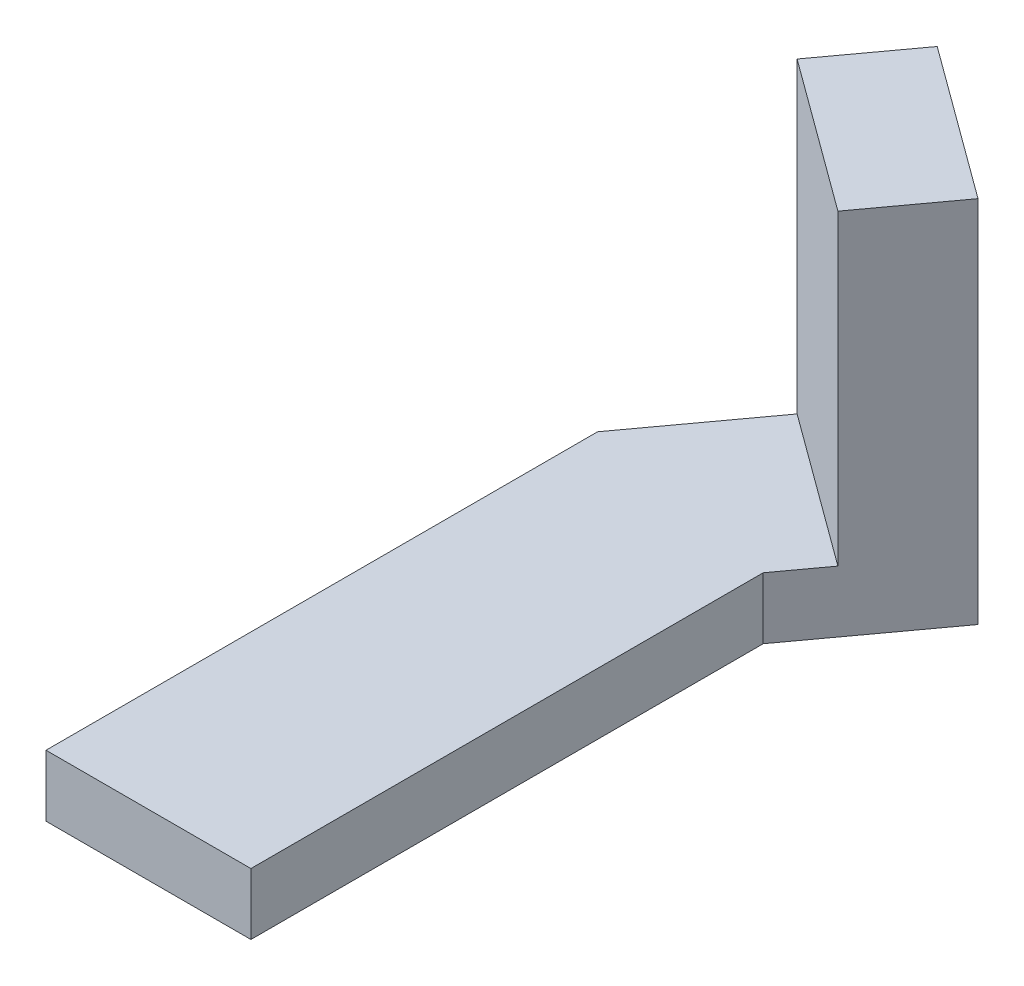
ISO-10303-21;
HEADER;
FILE_DESCRIPTION(('STEP AP214'),'2;1');
FILE_NAME('part.step','',(''),(''),'','','');
FILE_SCHEMA(('AUTOMOTIVE_DESIGN { 1 0 10303 214 1 1 1 1 }'));
ENDSEC;
DATA;
#1=APPLICATION_CONTEXT('core data for automotive mechanical design processes');
#2=APPLICATION_PROTOCOL_DEFINITION('international standard','automotive_design',2000,#1);
#3=PRODUCT_CONTEXT('',#1,'mechanical');
#4=PRODUCT('Part','Part','',(#3));
#5=PRODUCT_RELATED_PRODUCT_CATEGORY('part','',(#4));
#6=PRODUCT_DEFINITION_FORMATION('','',#4);
#7=PRODUCT_DEFINITION_CONTEXT('part definition',#1,'design');
#8=PRODUCT_DEFINITION('design','',#6,#7);
#9=PRODUCT_DEFINITION_SHAPE('','',#8);
#10=(LENGTH_UNIT() NAMED_UNIT(*) SI_UNIT(.MILLI.,.METRE.));
#11=(NAMED_UNIT(*) PLANE_ANGLE_UNIT() SI_UNIT($,.RADIAN.));
#12=(NAMED_UNIT(*) SI_UNIT($,.STERADIAN.) SOLID_ANGLE_UNIT());
#13=UNCERTAINTY_MEASURE_WITH_UNIT(LENGTH_MEASURE(1.E-05),#10,'distance_accuracy_value','');
#14=(GEOMETRIC_REPRESENTATION_CONTEXT(3) GLOBAL_UNCERTAINTY_ASSIGNED_CONTEXT((#13)) GLOBAL_UNIT_ASSIGNED_CONTEXT((#10,
#11,#12)) REPRESENTATION_CONTEXT('',''));
#15=CARTESIAN_POINT('',(0.,0.,0.));
#16=DIRECTION('',(0.,0.,1.));
#17=DIRECTION('',(1.,0.,0.));
#18=AXIS2_PLACEMENT_3D('',#15,#16,#17);
#19=CARTESIAN_POINT('',(0.,6.,-53.8333638680084));
#20=DIRECTION('',(1.,0.,0.));
#21=DIRECTION('',(0.,0.,-1.));
#22=AXIS2_PLACEMENT_3D('',#19,#20,#21);
#23=PLANE('',#22);
#24=DIRECTION('',(0.,0.,1.));
#25=VECTOR('',#24,1.);
#26=CARTESIAN_POINT('',(0.,0.,-53.8333638680084));
#27=LINE('',#26,#25);
#28=CARTESIAN_POINT('',(0.,0.,-53.8333638680084));
#29=VERTEX_POINT('',#28);
#30=CARTESIAN_POINT('',(0.,0.,0.));
#31=VERTEX_POINT('',#30);
#32=EDGE_CURVE('E157',#29,#31,#27,.T.);
#33=ORIENTED_EDGE('',*,*,#32,.T.);
#34=DIRECTION('',(0.,-1.,0.));
#35=VECTOR('',#34,1.);
#36=CARTESIAN_POINT('',(0.,6.,0.));
#37=LINE('',#36,#35);
#38=CARTESIAN_POINT('',(0.,6.,0.));
#39=VERTEX_POINT('',#38);
#40=EDGE_CURVE('E11',#39,#31,#37,.T.);
#41=ORIENTED_EDGE('',*,*,#40,.F.);
#42=DIRECTION('',(0.,0.,1.));
#43=VECTOR('',#42,1.);
#44=CARTESIAN_POINT('',(0.,6.,-53.8333638680084));
#45=LINE('',#44,#43);
#46=CARTESIAN_POINT('',(0.,6.,-53.8333638680084));
#47=VERTEX_POINT('',#46);
#48=EDGE_CURVE('E158',#47,#39,#45,.T.);
#49=ORIENTED_EDGE('',*,*,#48,.F.);
#50=DIRECTION('',(0.,-1.,0.));
#51=VECTOR('',#50,1.);
#52=CARTESIAN_POINT('',(0.,6.,-53.8333638680084));
#53=LINE('',#52,#51);
#54=EDGE_CURVE('E126',#47,#29,#53,.T.);
#55=ORIENTED_EDGE('',*,*,#54,.T.);
#56=EDGE_LOOP('',(#33,#41,#49,#55));
#57=FACE_BOUND('',#56,.T.);
#58=ADVANCED_FACE('F45',(#57),#23,.F.);
#59=CARTESIAN_POINT('',(0.,6.,0.));
#60=DIRECTION('',(0.,0.,-1.));
#61=DIRECTION('',(-1.,0.,0.));
#62=AXIS2_PLACEMENT_3D('',#59,#60,#61);
#63=PLANE('',#62);
#64=DIRECTION('',(1.,0.,0.));
#65=VECTOR('',#64,1.);
#66=CARTESIAN_POINT('',(0.,0.,0.));
#67=LINE('',#66,#65);
#68=CARTESIAN_POINT('',(20.,0.,0.));
#69=VERTEX_POINT('',#68);
#70=EDGE_CURVE('E174',#31,#69,#67,.T.);
#71=ORIENTED_EDGE('',*,*,#70,.T.);
#72=DIRECTION('',(0.,-1.,0.));
#73=VECTOR('',#72,1.);
#74=CARTESIAN_POINT('',(20.,6.,0.));
#75=LINE('',#74,#73);
#76=CARTESIAN_POINT('',(20.,6.,0.));
#77=VERTEX_POINT('',#76);
#78=EDGE_CURVE('E53',#77,#69,#75,.T.);
#79=ORIENTED_EDGE('',*,*,#78,.F.);
#80=DIRECTION('',(1.,0.,0.));
#81=VECTOR('',#80,1.);
#82=CARTESIAN_POINT('',(0.,6.,0.));
#83=LINE('',#82,#81);
#84=EDGE_CURVE('E100',#39,#77,#83,.T.);
#85=ORIENTED_EDGE('',*,*,#84,.F.);
#86=ORIENTED_EDGE('',*,*,#40,.T.);
#87=EDGE_LOOP('',(#71,#79,#85,#86));
#88=FACE_BOUND('',#87,.T.);
#89=ADVANCED_FACE('F223',(#88),#63,.F.);
#90=CARTESIAN_POINT('',(20.,6.,0.));
#91=DIRECTION('',(-1.,0.,0.));
#92=DIRECTION('',(0.,0.,1.));
#93=AXIS2_PLACEMENT_3D('',#90,#91,#92);
#94=PLANE('',#93);
#95=DIRECTION('',(0.,0.,-1.));
#96=VECTOR('',#95,1.);
#97=CARTESIAN_POINT('',(20.,0.,0.));
#98=LINE('',#97,#96);
#99=CARTESIAN_POINT('',(20.,0.,-50.));
#100=VERTEX_POINT('',#99);
#101=EDGE_CURVE('E177',#69,#100,#98,.T.);
#102=ORIENTED_EDGE('',*,*,#101,.T.);
#103=DIRECTION('',(0.,-1.,0.));
#104=VECTOR('',#103,1.);
#105=CARTESIAN_POINT('',(20.,6.,-50.));
#106=LINE('',#105,#104);
#107=CARTESIAN_POINT('',(20.,6.,-50.));
#108=VERTEX_POINT('',#107);
#109=EDGE_CURVE('E191',#108,#100,#106,.T.);
#110=ORIENTED_EDGE('',*,*,#109,.F.);
#111=DIRECTION('',(0.,0.,-1.));
#112=VECTOR('',#111,1.);
#113=CARTESIAN_POINT('',(20.,6.,0.));
#114=LINE('',#113,#112);
#115=EDGE_CURVE('E163',#77,#108,#114,.T.);
#116=ORIENTED_EDGE('',*,*,#115,.F.);
#117=ORIENTED_EDGE('',*,*,#78,.T.);
#118=EDGE_LOOP('',(#102,#110,#116,#117));
#119=FACE_BOUND('',#118,.T.);
#120=ADVANCED_FACE('F199',(#119),#94,.F.);
#121=CARTESIAN_POINT('',(20.,6.,-50.));
#122=DIRECTION('',(-0.806963294861052,0.,-0.590601592232018));
#123=DIRECTION('',(-0.590601592232018,0.,0.806963294861052));
#124=AXIS2_PLACEMENT_3D('',#121,#122,#123);
#125=PLANE('',#124);
#126=DIRECTION('',(0.590601592232018,0.,-0.806963294861052));
#127=VECTOR('',#126,1.);
#128=CARTESIAN_POINT('',(20.,0.,-50.));
#129=LINE('',#128,#127);
#130=CARTESIAN_POINT('',(28.8590238834803,0.,-62.1044494229158));
#131=VERTEX_POINT('',#130);
#132=EDGE_CURVE('E180',#100,#131,#129,.T.);
#133=ORIENTED_EDGE('',*,*,#132,.T.);
#134=DIRECTION('',(0.,-1.,0.));
#135=VECTOR('',#134,1.);
#136=CARTESIAN_POINT('',(28.8590238834803,6.,-62.1044494229158));
#137=LINE('',#136,#135);
#138=CARTESIAN_POINT('',(28.8590238834803,36.,-62.1044494229158));
#139=VERTEX_POINT('',#138);
#140=EDGE_CURVE('E125',#139,#131,#137,.T.);
#141=ORIENTED_EDGE('',*,*,#140,.F.);
#142=DIRECTION('',(0.590601592232018,0.,-0.806963294861052));
#143=VECTOR('',#142,1.);
#144=CARTESIAN_POINT('',(23.0804313938122,36.,-54.2089203616091));
#145=LINE('',#144,#143);
#146=CARTESIAN_POINT('',(23.0804313938122,36.,-54.2089203616091));
#147=VERTEX_POINT('',#146);
#148=EDGE_CURVE('E141',#147,#139,#145,.T.);
#149=ORIENTED_EDGE('',*,*,#148,.F.);
#150=DIRECTION('',(0.,-1.,0.));
#151=VECTOR('',#150,1.);
#152=CARTESIAN_POINT('',(23.0804313938122,36.,-54.2089203616091));
#153=LINE('',#152,#151);
#154=CARTESIAN_POINT('',(23.0804313938122,6.,-54.2089203616091));
#155=VERTEX_POINT('',#154);
#156=EDGE_CURVE('E150',#147,#155,#153,.T.);
#157=ORIENTED_EDGE('',*,*,#156,.T.);
#158=DIRECTION('',(0.590601592232018,0.,-0.806963294861052));
#159=VECTOR('',#158,1.);
#160=CARTESIAN_POINT('',(20.,6.,-50.));
#161=LINE('',#160,#159);
#162=EDGE_CURVE('E166',#108,#155,#161,.T.);
#163=ORIENTED_EDGE('',*,*,#162,.F.);
#164=ORIENTED_EDGE('',*,*,#109,.T.);
#165=EDGE_LOOP('',(#133,#141,#149,#157,#163,#164));
#166=FACE_BOUND('',#165,.T.);
#167=ADVANCED_FACE('F206',(#166),#125,.F.);
#168=CARTESIAN_POINT('',(28.8590238834803,6.,-62.1044494229158));
#169=DIRECTION('',(-0.590601592232018,0.,0.806963294861052));
#170=DIRECTION('',(0.806963294861052,0.,0.590601592232019));
#171=AXIS2_PLACEMENT_3D('',#168,#169,#170);
#172=PLANE('',#171);
#173=DIRECTION('',(-0.806963294861052,0.,-0.590601592232019));
#174=VECTOR('',#173,1.);
#175=CARTESIAN_POINT('',(28.8590238834803,0.,-62.1044494229158));
#176=LINE('',#175,#174);
#177=CARTESIAN_POINT('',(14.0082712196485,0.,-72.9734421329413));
#178=VERTEX_POINT('',#177);
#179=EDGE_CURVE('E123',#131,#178,#176,.T.);
#180=ORIENTED_EDGE('',*,*,#179,.T.);
#181=DIRECTION('',(0.,-1.,0.));
#182=VECTOR('',#181,1.);
#183=CARTESIAN_POINT('',(14.0082712196485,6.,-72.9734421329413));
#184=LINE('',#183,#182);
#185=CARTESIAN_POINT('',(14.0082712196485,36.,-72.9734421329413));
#186=VERTEX_POINT('',#185);
#187=EDGE_CURVE('E116',#186,#178,#184,.T.);
#188=ORIENTED_EDGE('',*,*,#187,.F.);
#189=DIRECTION('',(-0.806963294861052,0.,-0.590601592232019));
#190=VECTOR('',#189,1.);
#191=CARTESIAN_POINT('',(28.8590238834803,36.,-62.1044494229158));
#192=LINE('',#191,#190);
#193=EDGE_CURVE('E121',#139,#186,#192,.T.);
#194=ORIENTED_EDGE('',*,*,#193,.F.);
#195=ORIENTED_EDGE('',*,*,#140,.T.);
#196=EDGE_LOOP('',(#180,#188,#194,#195));
#197=FACE_BOUND('',#196,.T.);
#198=ADVANCED_FACE('F118',(#197),#172,.F.);
#199=CARTESIAN_POINT('',(14.0082712196485,6.,-72.9734421329413));
#200=DIRECTION('',(0.806963294861052,0.,0.590601592232019));
#201=DIRECTION('',(0.590601592232019,0.,-0.806963294861052));
#202=AXIS2_PLACEMENT_3D('',#199,#200,#201);
#203=PLANE('',#202);
#204=DIRECTION('',(-0.590601592232019,0.,0.806963294861051));
#205=VECTOR('',#204,1.);
#206=CARTESIAN_POINT('',(14.0082712196485,0.,-72.9734421329413));
#207=LINE('',#206,#205);
#208=EDGE_CURVE('E93',#178,#29,#207,.T.);
#209=ORIENTED_EDGE('',*,*,#208,.T.);
#210=ORIENTED_EDGE('',*,*,#54,.F.);
#211=DIRECTION('',(-0.590601592232019,0.,0.806963294861051));
#212=VECTOR('',#211,1.);
#213=CARTESIAN_POINT('',(14.0082712196485,6.,-72.9734421329413));
#214=LINE('',#213,#212);
#215=CARTESIAN_POINT('',(8.22967872998044,6.,-65.0779130716346));
#216=VERTEX_POINT('',#215);
#217=EDGE_CURVE('E65',#216,#47,#214,.T.);
#218=ORIENTED_EDGE('',*,*,#217,.F.);
#219=DIRECTION('',(0.,-1.,0.));
#220=VECTOR('',#219,1.);
#221=CARTESIAN_POINT('',(8.22967872998044,36.,-65.0779130716346));
#222=LINE('',#221,#220);
#223=CARTESIAN_POINT('',(8.22967872998044,36.,-65.0779130716346));
#224=VERTEX_POINT('',#223);
#225=EDGE_CURVE('E132',#224,#216,#222,.T.);
#226=ORIENTED_EDGE('',*,*,#225,.F.);
#227=DIRECTION('',(-0.590601592232019,0.,0.806963294861051));
#228=VECTOR('',#227,1.);
#229=CARTESIAN_POINT('',(14.0082712196485,36.,-72.9734421329413));
#230=LINE('',#229,#228);
#231=EDGE_CURVE('E129',#186,#224,#230,.T.);
#232=ORIENTED_EDGE('',*,*,#231,.F.);
#233=ORIENTED_EDGE('',*,*,#187,.T.);
#234=EDGE_LOOP('',(#209,#210,#218,#226,#232,#233));
#235=FACE_BOUND('',#234,.T.);
#236=ADVANCED_FACE('F130',(#235),#203,.F.);
#237=CARTESIAN_POINT('',(0.,6.,0.));
#238=DIRECTION('',(0.,1.,0.));
#239=DIRECTION('',(0.,0.,1.));
#240=AXIS2_PLACEMENT_3D('',#237,#238,#239);
#241=PLANE('',#240);
#242=DIRECTION('',(0.806963294861052,0.,0.590601592232018));
#243=VECTOR('',#242,1.);
#244=CARTESIAN_POINT('',(8.22967872998044,6.,-65.0779130716346));
#245=LINE('',#244,#243);
#246=EDGE_CURVE('E60',#216,#155,#245,.T.);
#247=ORIENTED_EDGE('',*,*,#246,.F.);
#248=ORIENTED_EDGE('',*,*,#217,.T.);
#249=ORIENTED_EDGE('',*,*,#48,.T.);
#250=ORIENTED_EDGE('',*,*,#84,.T.);
#251=ORIENTED_EDGE('',*,*,#115,.T.);
#252=ORIENTED_EDGE('',*,*,#162,.T.);
#253=EDGE_LOOP('',(#247,#248,#249,#250,#251,#252));
#254=FACE_BOUND('',#253,.T.);
#255=ADVANCED_FACE('F209',(#254),#241,.T.);
#256=CARTESIAN_POINT('',(0.,0.,0.));
#257=DIRECTION('',(0.,1.,0.));
#258=DIRECTION('',(0.,0.,1.));
#259=AXIS2_PLACEMENT_3D('',#256,#257,#258);
#260=PLANE('',#259);
#261=ORIENTED_EDGE('',*,*,#32,.F.);
#262=ORIENTED_EDGE('',*,*,#208,.F.);
#263=ORIENTED_EDGE('',*,*,#179,.F.);
#264=ORIENTED_EDGE('',*,*,#132,.F.);
#265=ORIENTED_EDGE('',*,*,#101,.F.);
#266=ORIENTED_EDGE('',*,*,#70,.F.);
#267=EDGE_LOOP('',(#261,#262,#263,#264,#265,#266));
#268=FACE_BOUND('',#267,.T.);
#269=ADVANCED_FACE('F204',(#268),#260,.F.);
#270=CARTESIAN_POINT('',(8.22967872998044,36.,-65.0779130716346));
#271=DIRECTION('',(0.590601592232018,0.,-0.806963294861052));
#272=DIRECTION('',(-0.806963294861052,0.,-0.590601592232018));
#273=AXIS2_PLACEMENT_3D('',#270,#271,#272);
#274=PLANE('',#273);
#275=ORIENTED_EDGE('',*,*,#246,.T.);
#276=ORIENTED_EDGE('',*,*,#156,.F.);
#277=DIRECTION('',(0.806963294861052,0.,0.590601592232018));
#278=VECTOR('',#277,1.);
#279=CARTESIAN_POINT('',(8.22967872998044,36.,-65.0779130716346));
#280=LINE('',#279,#278);
#281=EDGE_CURVE('E136',#224,#147,#280,.T.);
#282=ORIENTED_EDGE('',*,*,#281,.F.);
#283=ORIENTED_EDGE('',*,*,#225,.T.);
#284=EDGE_LOOP('',(#275,#276,#282,#283));
#285=FACE_BOUND('',#284,.T.);
#286=ADVANCED_FACE('F211',(#285),#274,.F.);
#287=CARTESIAN_POINT('',(0.,36.,0.));
#288=DIRECTION('',(0.,1.,0.));
#289=DIRECTION('',(0.,0.,1.));
#290=AXIS2_PLACEMENT_3D('',#287,#288,#289);
#291=PLANE('',#290);
#292=ORIENTED_EDGE('',*,*,#193,.T.);
#293=ORIENTED_EDGE('',*,*,#231,.T.);
#294=ORIENTED_EDGE('',*,*,#281,.T.);
#295=ORIENTED_EDGE('',*,*,#148,.T.);
#296=EDGE_LOOP('',(#292,#293,#294,#295));
#297=FACE_BOUND('',#296,.T.);
#298=ADVANCED_FACE('F139',(#297),#291,.T.);
#299=CLOSED_SHELL('',(#58,#89,#120,#167,#198,#236,#255,#269,#286,#298));
#300=MANIFOLD_SOLID_BREP('B2',#299);
#301=ADVANCED_BREP_SHAPE_REPRESENTATION('',(#18,#300),#14);
#302=SHAPE_DEFINITION_REPRESENTATION(#9,#301);
ENDSEC;
END-ISO-10303-21;
